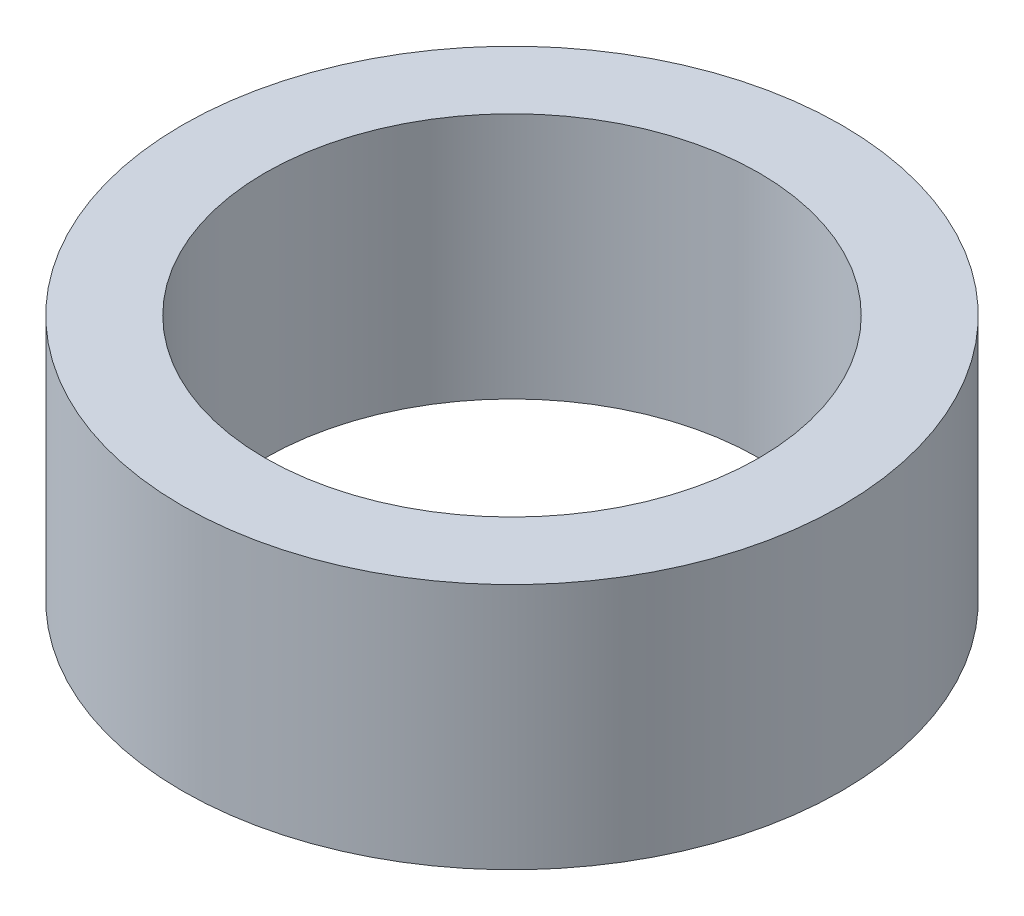
ISO-10303-21;
HEADER;
FILE_DESCRIPTION(('STEP AP214'),'2;1');
FILE_NAME('part.step','',(''),(''),'','','');
FILE_SCHEMA(('AUTOMOTIVE_DESIGN { 1 0 10303 214 1 1 1 1 }'));
ENDSEC;
DATA;
#1=APPLICATION_CONTEXT('core data for automotive mechanical design processes');
#2=APPLICATION_PROTOCOL_DEFINITION('international standard','automotive_design',2000,#1);
#3=PRODUCT_CONTEXT('',#1,'mechanical');
#4=PRODUCT('Part','Part','',(#3));
#5=PRODUCT_RELATED_PRODUCT_CATEGORY('part','',(#4));
#6=PRODUCT_DEFINITION_FORMATION('','',#4);
#7=PRODUCT_DEFINITION_CONTEXT('part definition',#1,'design');
#8=PRODUCT_DEFINITION('design','',#6,#7);
#9=PRODUCT_DEFINITION_SHAPE('','',#8);
#10=(LENGTH_UNIT() NAMED_UNIT(*) SI_UNIT(.MILLI.,.METRE.));
#11=(NAMED_UNIT(*) PLANE_ANGLE_UNIT() SI_UNIT($,.RADIAN.));
#12=(NAMED_UNIT(*) SI_UNIT($,.STERADIAN.) SOLID_ANGLE_UNIT());
#13=UNCERTAINTY_MEASURE_WITH_UNIT(LENGTH_MEASURE(1.E-05),#10,'distance_accuracy_value','');
#14=(GEOMETRIC_REPRESENTATION_CONTEXT(3) GLOBAL_UNCERTAINTY_ASSIGNED_CONTEXT((#13)) GLOBAL_UNIT_ASSIGNED_CONTEXT((#10,
#11,#12)) REPRESENTATION_CONTEXT('',''));
#15=CARTESIAN_POINT('',(0.,0.,0.));
#16=DIRECTION('',(0.,0.,1.));
#17=DIRECTION('',(1.,0.,0.));
#18=AXIS2_PLACEMENT_3D('',#15,#16,#17);
#19=CARTESIAN_POINT('',(0.,10.,0.));
#20=DIRECTION('',(0.,-1.,0.));
#21=DIRECTION('',(0.,0.,-1.));
#22=AXIS2_PLACEMENT_3D('',#19,#20,#21);
#23=CYLINDRICAL_SURFACE('',#22,13.35);
#24=CARTESIAN_POINT('',(0.,10.,0.));
#25=DIRECTION('',(0.,1.,0.));
#26=DIRECTION('',(0.,0.,1.));
#27=AXIS2_PLACEMENT_3D('',#24,#25,#26);
#28=CIRCLE('',#27,13.35);
#29=CARTESIAN_POINT('',(0.,10.,13.35));
#30=VERTEX_POINT('',#29);
#31=EDGE_CURVE('E10',#30,#30,#28,.T.);
#32=ORIENTED_EDGE('',*,*,#31,.F.);
#33=EDGE_LOOP('',(#32));
#34=FACE_BOUND('',#33,.T.);
#35=CARTESIAN_POINT('',(0.,0.,0.));
#36=DIRECTION('',(0.,1.,0.));
#37=DIRECTION('',(0.,0.,1.));
#38=AXIS2_PLACEMENT_3D('',#35,#36,#37);
#39=CIRCLE('',#38,13.35);
#40=CARTESIAN_POINT('',(0.,0.,13.35));
#41=VERTEX_POINT('',#40);
#42=EDGE_CURVE('E40',#41,#41,#39,.T.);
#43=ORIENTED_EDGE('',*,*,#42,.T.);
#44=EDGE_LOOP('',(#43));
#45=FACE_BOUND('',#44,.T.);
#46=ADVANCED_FACE('F37',(#34,#45),#23,.T.);
#47=CARTESIAN_POINT('',(0.,10.,0.));
#48=DIRECTION('',(0.,1.,0.));
#49=DIRECTION('',(0.,0.,1.));
#50=AXIS2_PLACEMENT_3D('',#47,#48,#49);
#51=PLANE('',#50);
#52=CARTESIAN_POINT('',(0.,10.,0.));
#53=DIRECTION('',(0.,1.,0.));
#54=DIRECTION('',(0.,0.,1.));
#55=AXIS2_PLACEMENT_3D('',#52,#53,#54);
#56=CIRCLE('',#55,10.);
#57=CARTESIAN_POINT('',(0.,10.,10.));
#58=VERTEX_POINT('',#57);
#59=EDGE_CURVE('E49',#58,#58,#56,.F.);
#60=ORIENTED_EDGE('',*,*,#59,.T.);
#61=EDGE_LOOP('',(#60));
#62=FACE_BOUND('',#61,.T.);
#63=ORIENTED_EDGE('',*,*,#31,.T.);
#64=EDGE_LOOP('',(#63));
#65=FACE_BOUND('',#64,.T.);
#66=ADVANCED_FACE('F69',(#62,#65),#51,.T.);
#67=CARTESIAN_POINT('',(0.,0.,0.));
#68=DIRECTION('',(0.,1.,0.));
#69=DIRECTION('',(0.,0.,1.));
#70=AXIS2_PLACEMENT_3D('',#67,#68,#69);
#71=PLANE('',#70);
#72=CARTESIAN_POINT('',(0.,0.,0.));
#73=DIRECTION('',(0.,1.,0.));
#74=DIRECTION('',(0.,0.,1.));
#75=AXIS2_PLACEMENT_3D('',#72,#73,#74);
#76=CIRCLE('',#75,10.);
#77=CARTESIAN_POINT('',(0.,0.,10.));
#78=VERTEX_POINT('',#77);
#79=EDGE_CURVE('E54',#78,#78,#76,.T.);
#80=ORIENTED_EDGE('',*,*,#79,.T.);
#81=EDGE_LOOP('',(#80));
#82=FACE_BOUND('',#81,.T.);
#83=ORIENTED_EDGE('',*,*,#42,.F.);
#84=EDGE_LOOP('',(#83));
#85=FACE_BOUND('',#84,.T.);
#86=ADVANCED_FACE('F59',(#82,#85),#71,.F.);
#87=CARTESIAN_POINT('',(0.,12.,0.));
#88=DIRECTION('',(0.,-1.,0.));
#89=DIRECTION('',(0.,0.,-1.));
#90=AXIS2_PLACEMENT_3D('',#87,#88,#89);
#91=CYLINDRICAL_SURFACE('',#90,10.);
#92=ORIENTED_EDGE('',*,*,#59,.F.);
#93=EDGE_LOOP('',(#92));
#94=FACE_BOUND('',#93,.T.);
#95=ORIENTED_EDGE('',*,*,#79,.F.);
#96=EDGE_LOOP('',(#95));
#97=FACE_BOUND('',#96,.T.);
#98=ADVANCED_FACE('F62',(#94,#97),#91,.F.);
#99=CLOSED_SHELL('',(#46,#66,#86,#98));
#100=MANIFOLD_SOLID_BREP('B2',#99);
#101=ADVANCED_BREP_SHAPE_REPRESENTATION('',(#18,#100),#14);
#102=SHAPE_DEFINITION_REPRESENTATION(#9,#101);
ENDSEC;
END-ISO-10303-21;
